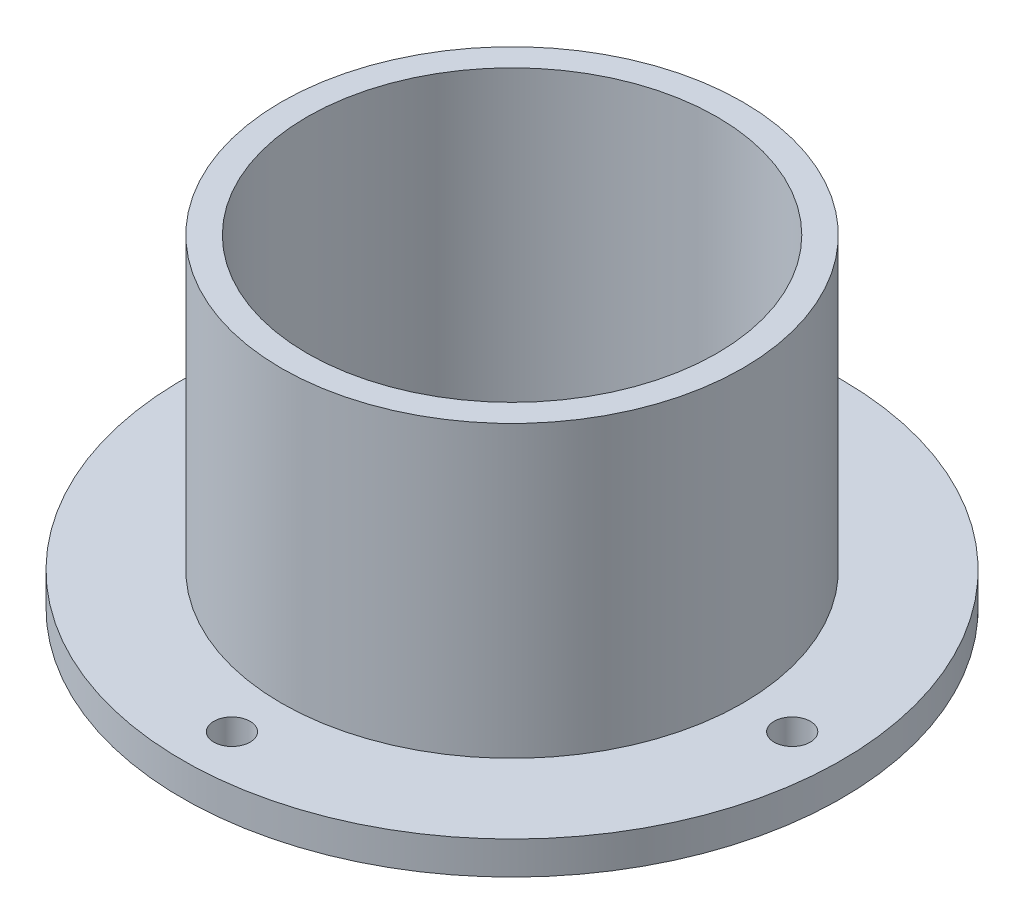
ISO-10303-21;
HEADER;
FILE_DESCRIPTION(('STEP AP214'),'2;1');
FILE_NAME('part.step','',(''),(''),'','','');
FILE_SCHEMA(('AUTOMOTIVE_DESIGN { 1 0 10303 214 1 1 1 1 }'));
ENDSEC;
DATA;
#1=APPLICATION_CONTEXT('core data for automotive mechanical design processes');
#2=APPLICATION_PROTOCOL_DEFINITION('international standard','automotive_design',2000,#1);
#3=PRODUCT_CONTEXT('',#1,'mechanical');
#4=PRODUCT('Part','Part','',(#3));
#5=PRODUCT_RELATED_PRODUCT_CATEGORY('part','',(#4));
#6=PRODUCT_DEFINITION_FORMATION('','',#4);
#7=PRODUCT_DEFINITION_CONTEXT('part definition',#1,'design');
#8=PRODUCT_DEFINITION('design','',#6,#7);
#9=PRODUCT_DEFINITION_SHAPE('','',#8);
#10=(LENGTH_UNIT() NAMED_UNIT(*) SI_UNIT(.MILLI.,.METRE.));
#11=(NAMED_UNIT(*) PLANE_ANGLE_UNIT() SI_UNIT($,.RADIAN.));
#12=(NAMED_UNIT(*) SI_UNIT($,.STERADIAN.) SOLID_ANGLE_UNIT());
#13=UNCERTAINTY_MEASURE_WITH_UNIT(LENGTH_MEASURE(1.E-05),#10,'distance_accuracy_value','');
#14=(GEOMETRIC_REPRESENTATION_CONTEXT(3) GLOBAL_UNCERTAINTY_ASSIGNED_CONTEXT((#13)) GLOBAL_UNIT_ASSIGNED_CONTEXT((#10,
#11,#12)) REPRESENTATION_CONTEXT('',''));
#15=CARTESIAN_POINT('',(0.,0.,0.));
#16=DIRECTION('',(0.,0.,1.));
#17=DIRECTION('',(1.,0.,0.));
#18=AXIS2_PLACEMENT_3D('',#15,#16,#17);
#19=CARTESIAN_POINT('',(0.,9.,0.));
#20=DIRECTION('',(0.,-1.,0.));
#21=DIRECTION('',(0.,0.,-1.));
#22=AXIS2_PLACEMENT_3D('',#19,#20,#21);
#23=CYLINDRICAL_SURFACE('',#22,35.);
#24=CARTESIAN_POINT('',(0.,9.,0.));
#25=DIRECTION('',(0.,1.,0.));
#26=DIRECTION('',(0.,0.,1.));
#27=AXIS2_PLACEMENT_3D('',#24,#25,#26);
#28=CIRCLE('',#27,35.);
#29=CARTESIAN_POINT('',(0.,9.,35.));
#30=VERTEX_POINT('',#29);
#31=EDGE_CURVE('E45',#30,#30,#28,.T.);
#32=ORIENTED_EDGE('',*,*,#31,.F.);
#33=EDGE_LOOP('',(#32));
#34=FACE_BOUND('',#33,.T.);
#35=CARTESIAN_POINT('',(0.,-35.,0.));
#36=DIRECTION('',(0.,-1.,0.));
#37=DIRECTION('',(0.,0.,-1.));
#38=AXIS2_PLACEMENT_3D('',#35,#36,#37);
#39=CIRCLE('',#38,35.);
#40=CARTESIAN_POINT('',(0.,-35.,-35.));
#41=VERTEX_POINT('',#40);
#42=EDGE_CURVE('E10',#41,#41,#39,.T.);
#43=ORIENTED_EDGE('',*,*,#42,.F.);
#44=EDGE_LOOP('',(#43));
#45=FACE_BOUND('',#44,.T.);
#46=ADVANCED_FACE('F42',(#34,#45),#23,.T.);
#47=CARTESIAN_POINT('',(0.,9.,0.));
#48=DIRECTION('',(0.,-1.,0.));
#49=DIRECTION('',(0.,0.,-1.));
#50=AXIS2_PLACEMENT_3D('',#47,#48,#49);
#51=CYLINDRICAL_SURFACE('',#50,31.0832015946794);
#52=CARTESIAN_POINT('',(0.,9.,0.));
#53=DIRECTION('',(0.,-1.,0.));
#54=DIRECTION('',(0.,0.,-1.));
#55=AXIS2_PLACEMENT_3D('',#52,#53,#54);
#56=CIRCLE('',#55,31.0832015946794);
#57=CARTESIAN_POINT('',(0.,9.,-31.0832015946794));
#58=VERTEX_POINT('',#57);
#59=EDGE_CURVE('E55',#58,#58,#56,.T.);
#60=ORIENTED_EDGE('',*,*,#59,.F.);
#61=EDGE_LOOP('',(#60));
#62=FACE_BOUND('',#61,.T.);
#63=CARTESIAN_POINT('',(0.,-40.,0.));
#64=DIRECTION('',(0.,1.,0.));
#65=DIRECTION('',(0.,0.,1.));
#66=AXIS2_PLACEMENT_3D('',#63,#64,#65);
#67=CIRCLE('',#66,31.0832015946794);
#68=CARTESIAN_POINT('',(0.,-40.,31.0832015946794));
#69=VERTEX_POINT('',#68);
#70=EDGE_CURVE('E77',#69,#69,#67,.T.);
#71=ORIENTED_EDGE('',*,*,#70,.F.);
#72=EDGE_LOOP('',(#71));
#73=FACE_BOUND('',#72,.T.);
#74=ADVANCED_FACE('F111',(#62,#73),#51,.F.);
#75=CARTESIAN_POINT('',(0.,9.,0.));
#76=DIRECTION('',(0.,1.,0.));
#77=DIRECTION('',(0.,0.,1.));
#78=AXIS2_PLACEMENT_3D('',#75,#76,#77);
#79=PLANE('',#78);
#80=ORIENTED_EDGE('',*,*,#59,.T.);
#81=EDGE_LOOP('',(#80));
#82=FACE_BOUND('',#81,.T.);
#83=ORIENTED_EDGE('',*,*,#31,.T.);
#84=EDGE_LOOP('',(#83));
#85=FACE_BOUND('',#84,.T.);
#86=ADVANCED_FACE('F113',(#82,#85),#79,.T.);
#87=CARTESIAN_POINT('',(0.,-35.,0.));
#88=DIRECTION('',(0.,-1.,0.));
#89=DIRECTION('',(0.,0.,-1.));
#90=AXIS2_PLACEMENT_3D('',#87,#88,#89);
#91=PLANE('',#90);
#92=CARTESIAN_POINT('',(0.,-35.,-42.5));
#93=DIRECTION('',(0.,1.,0.));
#94=DIRECTION('',(0.,0.,1.));
#95=AXIS2_PLACEMENT_3D('',#92,#93,#94);
#96=CIRCLE('',#95,2.75);
#97=CARTESIAN_POINT('',(0.,-35.,-39.75));
#98=VERTEX_POINT('',#97);
#99=EDGE_CURVE('E97',#98,#98,#96,.T.);
#100=ORIENTED_EDGE('',*,*,#99,.F.);
#101=EDGE_LOOP('',(#100));
#102=FACE_BOUND('',#101,.T.);
#103=CARTESIAN_POINT('',(42.5000000000012,-35.,-1.20011552744761E-12));
#104=DIRECTION('',(0.,1.,0.));
#105=DIRECTION('',(0.,0.,1.));
#106=AXIS2_PLACEMENT_3D('',#103,#104,#105);
#107=CIRCLE('',#106,2.75000000000095);
#108=CARTESIAN_POINT('',(42.5000000000012,-35.,2.74999999999974));
#109=VERTEX_POINT('',#108);
#110=EDGE_CURVE('E93',#109,#109,#107,.T.);
#111=ORIENTED_EDGE('',*,*,#110,.F.);
#112=EDGE_LOOP('',(#111));
#113=FACE_BOUND('',#112,.T.);
#114=CARTESIAN_POINT('',(2.40023105489521E-12,-35.,42.5));
#115=DIRECTION('',(0.,1.,0.));
#116=DIRECTION('',(0.,0.,1.));
#117=AXIS2_PLACEMENT_3D('',#114,#115,#116);
#118=CIRCLE('',#117,2.75000000000258);
#119=CARTESIAN_POINT('',(2.40023105489521E-12,-35.,45.2500000000026));
#120=VERTEX_POINT('',#119);
#121=EDGE_CURVE('E85',#120,#120,#118,.T.);
#122=ORIENTED_EDGE('',*,*,#121,.F.);
#123=EDGE_LOOP('',(#122));
#124=FACE_BOUND('',#123,.T.);
#125=CARTESIAN_POINT('',(-42.4999999999988,-35.,1.20532027634398E-12));
#126=DIRECTION('',(0.,1.,0.));
#127=DIRECTION('',(0.,0.,1.));
#128=AXIS2_PLACEMENT_3D('',#125,#126,#127);
#129=CIRCLE('',#128,2.75000000000193);
#130=CARTESIAN_POINT('',(-42.4999999999988,-35.,2.75000000000314));
#131=VERTEX_POINT('',#130);
#132=EDGE_CURVE('E76',#131,#131,#129,.T.);
#133=ORIENTED_EDGE('',*,*,#132,.F.);
#134=EDGE_LOOP('',(#133));
#135=FACE_BOUND('',#134,.T.);
#136=CARTESIAN_POINT('',(0.,-35.,0.));
#137=DIRECTION('',(0.,-1.,0.));
#138=DIRECTION('',(0.,0.,-1.));
#139=AXIS2_PLACEMENT_3D('',#136,#137,#138);
#140=CIRCLE('',#139,50.);
#141=CARTESIAN_POINT('',(0.,-35.,-50.));
#142=VERTEX_POINT('',#141);
#143=EDGE_CURVE('E61',#142,#142,#140,.T.);
#144=ORIENTED_EDGE('',*,*,#143,.F.);
#145=EDGE_LOOP('',(#144));
#146=FACE_BOUND('',#145,.T.);
#147=ORIENTED_EDGE('',*,*,#42,.T.);
#148=EDGE_LOOP('',(#147));
#149=FACE_BOUND('',#148,.T.);
#150=ADVANCED_FACE('F120',(#102,#113,#124,#135,#146,#149),#91,.F.);
#151=CARTESIAN_POINT('',(0.,-35.,0.));
#152=DIRECTION('',(0.,-1.,0.));
#153=DIRECTION('',(0.,0.,-1.));
#154=AXIS2_PLACEMENT_3D('',#151,#152,#153);
#155=CYLINDRICAL_SURFACE('',#154,50.);
#156=ORIENTED_EDGE('',*,*,#143,.T.);
#157=EDGE_LOOP('',(#156));
#158=FACE_BOUND('',#157,.T.);
#159=CARTESIAN_POINT('',(0.,-40.,0.));
#160=DIRECTION('',(0.,-1.,0.));
#161=DIRECTION('',(0.,0.,-1.));
#162=AXIS2_PLACEMENT_3D('',#159,#160,#161);
#163=CIRCLE('',#162,50.);
#164=CARTESIAN_POINT('',(0.,-40.,-50.));
#165=VERTEX_POINT('',#164);
#166=EDGE_CURVE('E57',#165,#165,#163,.T.);
#167=ORIENTED_EDGE('',*,*,#166,.F.);
#168=EDGE_LOOP('',(#167));
#169=FACE_BOUND('',#168,.T.);
#170=ADVANCED_FACE('F125',(#158,#169),#155,.T.);
#171=CARTESIAN_POINT('',(0.,-40.,0.));
#172=DIRECTION('',(0.,-1.,0.));
#173=DIRECTION('',(0.,0.,-1.));
#174=AXIS2_PLACEMENT_3D('',#171,#172,#173);
#175=PLANE('',#174);
#176=ORIENTED_EDGE('',*,*,#70,.T.);
#177=EDGE_LOOP('',(#176));
#178=FACE_BOUND('',#177,.T.);
#179=CARTESIAN_POINT('',(0.,-40.,-42.5));
#180=DIRECTION('',(0.,1.,0.));
#181=DIRECTION('',(0.,0.,1.));
#182=AXIS2_PLACEMENT_3D('',#179,#180,#181);
#183=CIRCLE('',#182,2.75);
#184=CARTESIAN_POINT('',(0.,-40.,-39.75));
#185=VERTEX_POINT('',#184);
#186=EDGE_CURVE('E70',#185,#185,#183,.T.);
#187=ORIENTED_EDGE('',*,*,#186,.T.);
#188=EDGE_LOOP('',(#187));
#189=FACE_BOUND('',#188,.T.);
#190=CARTESIAN_POINT('',(42.5000000000012,-40.,-1.20011552744761E-12));
#191=DIRECTION('',(0.,1.,0.));
#192=DIRECTION('',(0.,0.,1.));
#193=AXIS2_PLACEMENT_3D('',#190,#191,#192);
#194=CIRCLE('',#193,2.75000000000095);
#195=CARTESIAN_POINT('',(42.5000000000012,-40.,2.74999999999974));
#196=VERTEX_POINT('',#195);
#197=EDGE_CURVE('E89',#196,#196,#194,.T.);
#198=ORIENTED_EDGE('',*,*,#197,.T.);
#199=EDGE_LOOP('',(#198));
#200=FACE_BOUND('',#199,.T.);
#201=CARTESIAN_POINT('',(2.40023105489521E-12,-40.,42.5));
#202=DIRECTION('',(0.,1.,0.));
#203=DIRECTION('',(0.,0.,1.));
#204=AXIS2_PLACEMENT_3D('',#201,#202,#203);
#205=CIRCLE('',#204,2.75000000000258);
#206=CARTESIAN_POINT('',(2.40023105489521E-12,-40.,45.2500000000026));
#207=VERTEX_POINT('',#206);
#208=EDGE_CURVE('E81',#207,#207,#205,.T.);
#209=ORIENTED_EDGE('',*,*,#208,.T.);
#210=EDGE_LOOP('',(#209));
#211=FACE_BOUND('',#210,.T.);
#212=CARTESIAN_POINT('',(-42.4999999999988,-40.,1.20532027634398E-12));
#213=DIRECTION('',(0.,1.,0.));
#214=DIRECTION('',(0.,0.,1.));
#215=AXIS2_PLACEMENT_3D('',#212,#213,#214);
#216=CIRCLE('',#215,2.75000000000193);
#217=CARTESIAN_POINT('',(-42.4999999999988,-40.,2.75000000000314));
#218=VERTEX_POINT('',#217);
#219=EDGE_CURVE('E72',#218,#218,#216,.T.);
#220=ORIENTED_EDGE('',*,*,#219,.T.);
#221=EDGE_LOOP('',(#220));
#222=FACE_BOUND('',#221,.T.);
#223=ORIENTED_EDGE('',*,*,#166,.T.);
#224=EDGE_LOOP('',(#223));
#225=FACE_BOUND('',#224,.T.);
#226=ADVANCED_FACE('F108',(#178,#189,#200,#211,#222,#225),#175,.T.);
#227=CARTESIAN_POINT('',(-42.4999999999988,-40.,1.20532027634398E-12));
#228=DIRECTION('',(0.,1.,0.));
#229=DIRECTION('',(0.,0.,1.));
#230=AXIS2_PLACEMENT_3D('',#227,#228,#229);
#231=CYLINDRICAL_SURFACE('',#230,2.75000000000193);
#232=ORIENTED_EDGE('',*,*,#219,.F.);
#233=EDGE_LOOP('',(#232));
#234=FACE_BOUND('',#233,.T.);
#235=ORIENTED_EDGE('',*,*,#132,.T.);
#236=EDGE_LOOP('',(#235));
#237=FACE_BOUND('',#236,.T.);
#238=ADVANCED_FACE('F124',(#234,#237),#231,.F.);
#239=CARTESIAN_POINT('',(2.40023105489521E-12,-40.,42.5));
#240=DIRECTION('',(0.,1.,0.));
#241=DIRECTION('',(0.,0.,1.));
#242=AXIS2_PLACEMENT_3D('',#239,#240,#241);
#243=CYLINDRICAL_SURFACE('',#242,2.75000000000258);
#244=ORIENTED_EDGE('',*,*,#208,.F.);
#245=EDGE_LOOP('',(#244));
#246=FACE_BOUND('',#245,.T.);
#247=ORIENTED_EDGE('',*,*,#121,.T.);
#248=EDGE_LOOP('',(#247));
#249=FACE_BOUND('',#248,.T.);
#250=ADVANCED_FACE('F133',(#246,#249),#243,.F.);
#251=CARTESIAN_POINT('',(42.5000000000012,-40.,-1.20011552744761E-12));
#252=DIRECTION('',(0.,1.,0.));
#253=DIRECTION('',(0.,0.,1.));
#254=AXIS2_PLACEMENT_3D('',#251,#252,#253);
#255=CYLINDRICAL_SURFACE('',#254,2.75000000000095);
#256=ORIENTED_EDGE('',*,*,#197,.F.);
#257=EDGE_LOOP('',(#256));
#258=FACE_BOUND('',#257,.T.);
#259=ORIENTED_EDGE('',*,*,#110,.T.);
#260=EDGE_LOOP('',(#259));
#261=FACE_BOUND('',#260,.T.);
#262=ADVANCED_FACE('F137',(#258,#261),#255,.F.);
#263=CARTESIAN_POINT('',(0.,-40.,-42.5));
#264=DIRECTION('',(0.,1.,0.));
#265=DIRECTION('',(0.,0.,1.));
#266=AXIS2_PLACEMENT_3D('',#263,#264,#265);
#267=CYLINDRICAL_SURFACE('',#266,2.75);
#268=ORIENTED_EDGE('',*,*,#186,.F.);
#269=EDGE_LOOP('',(#268));
#270=FACE_BOUND('',#269,.T.);
#271=ORIENTED_EDGE('',*,*,#99,.T.);
#272=EDGE_LOOP('',(#271));
#273=FACE_BOUND('',#272,.T.);
#274=ADVANCED_FACE('F141',(#270,#273),#267,.F.);
#275=CLOSED_SHELL('',(#46,#74,#86,#150,#170,#226,#238,#250,#262,#274));
#276=MANIFOLD_SOLID_BREP('B2',#275);
#277=ADVANCED_BREP_SHAPE_REPRESENTATION('',(#18,#276),#14);
#278=SHAPE_DEFINITION_REPRESENTATION(#9,#277);
ENDSEC;
END-ISO-10303-21;
